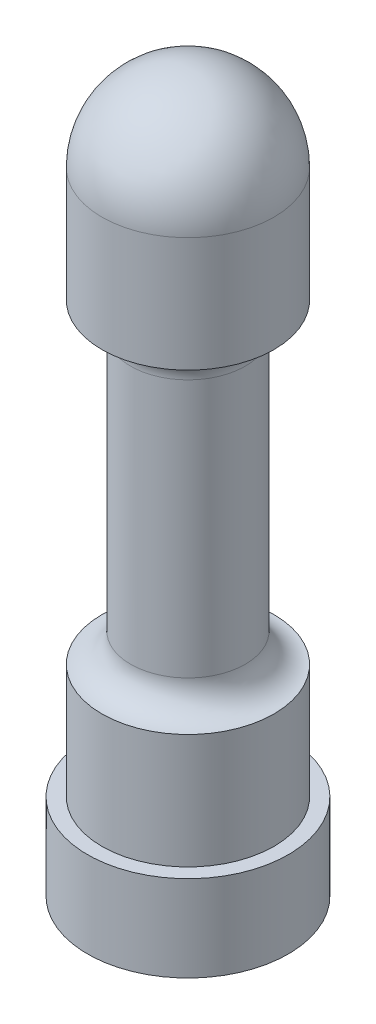
ISO-10303-21;
HEADER;
FILE_DESCRIPTION(('STEP AP214'),'2;1');
FILE_NAME('part.step','',(''),(''),'','','');
FILE_SCHEMA(('AUTOMOTIVE_DESIGN { 1 0 10303 214 1 1 1 1 }'));
ENDSEC;
DATA;
#1=APPLICATION_CONTEXT('core data for automotive mechanical design processes');
#2=APPLICATION_PROTOCOL_DEFINITION('international standard','automotive_design',2000,#1);
#3=PRODUCT_CONTEXT('',#1,'mechanical');
#4=PRODUCT('Part','Part','',(#3));
#5=PRODUCT_RELATED_PRODUCT_CATEGORY('part','',(#4));
#6=PRODUCT_DEFINITION_FORMATION('','',#4);
#7=PRODUCT_DEFINITION_CONTEXT('part definition',#1,'design');
#8=PRODUCT_DEFINITION('design','',#6,#7);
#9=PRODUCT_DEFINITION_SHAPE('','',#8);
#10=(LENGTH_UNIT() NAMED_UNIT(*) SI_UNIT(.MILLI.,.METRE.));
#11=(NAMED_UNIT(*) PLANE_ANGLE_UNIT() SI_UNIT($,.RADIAN.));
#12=(NAMED_UNIT(*) SI_UNIT($,.STERADIAN.) SOLID_ANGLE_UNIT());
#13=UNCERTAINTY_MEASURE_WITH_UNIT(LENGTH_MEASURE(1.E-05),#10,'distance_accuracy_value','');
#14=(GEOMETRIC_REPRESENTATION_CONTEXT(3) GLOBAL_UNCERTAINTY_ASSIGNED_CONTEXT((#13)) GLOBAL_UNIT_ASSIGNED_CONTEXT((#10,
#11,#12)) REPRESENTATION_CONTEXT('',''));
#15=CARTESIAN_POINT('',(0.,0.,0.));
#16=DIRECTION('',(0.,0.,1.));
#17=DIRECTION('',(1.,0.,0.));
#18=AXIS2_PLACEMENT_3D('',#15,#16,#17);
#19=CARTESIAN_POINT('',(0.,0.,0.));
#20=DIRECTION('',(0.,-1.,0.));
#21=DIRECTION('',(0.,0.,-1.));
#22=AXIS2_PLACEMENT_3D('',#19,#20,#21);
#23=CYLINDRICAL_SURFACE('',#22,3.);
#24=CARTESIAN_POINT('',(0.,22.,0.));
#25=DIRECTION('',(0.,-1.,0.));
#26=DIRECTION('',(0.,0.,-1.));
#27=AXIS2_PLACEMENT_3D('',#24,#25,#26);
#28=CIRCLE('',#27,3.);
#29=CARTESIAN_POINT('',(0.,22.,-3.));
#30=VERTEX_POINT('',#29);
#31=EDGE_CURVE('E54',#30,#30,#28,.T.);
#32=ORIENTED_EDGE('',*,*,#31,.T.);
#33=EDGE_LOOP('',(#32));
#34=FACE_BOUND('',#33,.T.);
#35=CARTESIAN_POINT('',(0.,18.,0.));
#36=DIRECTION('',(0.,-1.,0.));
#37=DIRECTION('',(0.,0.,-1.));
#38=AXIS2_PLACEMENT_3D('',#35,#36,#37);
#39=CIRCLE('',#38,3.);
#40=CARTESIAN_POINT('',(0.,18.,-3.));
#41=VERTEX_POINT('',#40);
#42=EDGE_CURVE('E59',#41,#41,#39,.T.);
#43=ORIENTED_EDGE('',*,*,#42,.F.);
#44=EDGE_LOOP('',(#43));
#45=FACE_BOUND('',#44,.T.);
#46=ADVANCED_FACE('F41',(#34,#45),#23,.T.);
#47=CARTESIAN_POINT('',(0.,0.,0.));
#48=DIRECTION('',(0.,-1.,0.));
#49=DIRECTION('',(0.,0.,-1.));
#50=AXIS2_PLACEMENT_3D('',#47,#48,#49);
#51=CYLINDRICAL_SURFACE('',#50,2.);
#52=CARTESIAN_POINT('',(0.,8.,0.));
#53=DIRECTION('',(0.,1.,0.));
#54=DIRECTION('',(0.,0.,1.));
#55=AXIS2_PLACEMENT_3D('',#52,#53,#54);
#56=CIRCLE('',#55,2.);
#57=CARTESIAN_POINT('',(0.,8.,2.));
#58=VERTEX_POINT('',#57);
#59=EDGE_CURVE('E10',#58,#58,#56,.T.);
#60=ORIENTED_EDGE('',*,*,#59,.T.);
#61=EDGE_LOOP('',(#60));
#62=FACE_BOUND('',#61,.T.);
#63=CARTESIAN_POINT('',(0.,17.,0.));
#64=DIRECTION('',(0.,-1.,0.));
#65=DIRECTION('',(0.,0.,-1.));
#66=AXIS2_PLACEMENT_3D('',#63,#64,#65);
#67=CIRCLE('',#66,2.);
#68=CARTESIAN_POINT('',(0.,17.,-2.));
#69=VERTEX_POINT('',#68);
#70=EDGE_CURVE('E49',#69,#69,#67,.T.);
#71=ORIENTED_EDGE('',*,*,#70,.T.);
#72=EDGE_LOOP('',(#71));
#73=FACE_BOUND('',#72,.T.);
#74=ADVANCED_FACE('F107',(#62,#73),#51,.T.);
#75=CARTESIAN_POINT('',(0.,0.,0.));
#76=DIRECTION('',(0.,-1.,0.));
#77=DIRECTION('',(0.,0.,-1.));
#78=AXIS2_PLACEMENT_3D('',#75,#76,#77);
#79=CYLINDRICAL_SURFACE('',#78,3.);
#80=CARTESIAN_POINT('',(0.,7.,0.));
#81=DIRECTION('',(0.,-1.,0.));
#82=DIRECTION('',(0.,0.,-1.));
#83=AXIS2_PLACEMENT_3D('',#80,#81,#82);
#84=CIRCLE('',#83,3.);
#85=CARTESIAN_POINT('',(0.,7.,-3.));
#86=VERTEX_POINT('',#85);
#87=EDGE_CURVE('E65',#86,#86,#84,.T.);
#88=ORIENTED_EDGE('',*,*,#87,.T.);
#89=EDGE_LOOP('',(#88));
#90=FACE_BOUND('',#89,.T.);
#91=CARTESIAN_POINT('',(0.,3.,0.));
#92=DIRECTION('',(0.,-1.,0.));
#93=DIRECTION('',(0.,0.,-1.));
#94=AXIS2_PLACEMENT_3D('',#91,#92,#93);
#95=CIRCLE('',#94,3.);
#96=CARTESIAN_POINT('',(0.,3.,-3.));
#97=VERTEX_POINT('',#96);
#98=EDGE_CURVE('E69',#97,#97,#95,.T.);
#99=ORIENTED_EDGE('',*,*,#98,.F.);
#100=EDGE_LOOP('',(#99));
#101=FACE_BOUND('',#100,.T.);
#102=ADVANCED_FACE('F103',(#90,#101),#79,.T.);
#103=CARTESIAN_POINT('',(3.,3.,0.));
#104=DIRECTION('',(0.,1.,0.));
#105=DIRECTION('',(0.,0.,1.));
#106=AXIS2_PLACEMENT_3D('',#103,#104,#105);
#107=PLANE('',#106);
#108=ORIENTED_EDGE('',*,*,#98,.T.);
#109=EDGE_LOOP('',(#108));
#110=FACE_BOUND('',#109,.T.);
#111=CARTESIAN_POINT('',(0.,3.,0.));
#112=DIRECTION('',(0.,-1.,0.));
#113=DIRECTION('',(0.,0.,-1.));
#114=AXIS2_PLACEMENT_3D('',#111,#112,#113);
#115=CIRCLE('',#114,3.5);
#116=CARTESIAN_POINT('',(0.,3.,-3.5));
#117=VERTEX_POINT('',#116);
#118=EDGE_CURVE('E73',#117,#117,#115,.T.);
#119=ORIENTED_EDGE('',*,*,#118,.F.);
#120=EDGE_LOOP('',(#119));
#121=FACE_BOUND('',#120,.T.);
#122=ADVANCED_FACE('F97',(#110,#121),#107,.T.);
#123=CARTESIAN_POINT('',(0.,0.,0.));
#124=DIRECTION('',(0.,-1.,0.));
#125=DIRECTION('',(0.,0.,-1.));
#126=AXIS2_PLACEMENT_3D('',#123,#124,#125);
#127=CYLINDRICAL_SURFACE('',#126,3.5);
#128=ORIENTED_EDGE('',*,*,#118,.T.);
#129=EDGE_LOOP('',(#128));
#130=FACE_BOUND('',#129,.T.);
#131=CARTESIAN_POINT('',(0.,0.,0.));
#132=DIRECTION('',(0.,-1.,0.));
#133=DIRECTION('',(0.,0.,-1.));
#134=AXIS2_PLACEMENT_3D('',#131,#132,#133);
#135=CIRCLE('',#134,3.5);
#136=CARTESIAN_POINT('',(0.,0.,-3.5));
#137=VERTEX_POINT('',#136);
#138=EDGE_CURVE('E77',#137,#137,#135,.T.);
#139=ORIENTED_EDGE('',*,*,#138,.F.);
#140=EDGE_LOOP('',(#139));
#141=FACE_BOUND('',#140,.T.);
#142=ADVANCED_FACE('F92',(#130,#141),#127,.T.);
#143=CARTESIAN_POINT('',(0.,0.,0.));
#144=DIRECTION('',(0.,-1.,0.));
#145=DIRECTION('',(0.,0.,-1.));
#146=AXIS2_PLACEMENT_3D('',#143,#144,#145);
#147=PLANE('',#146);
#148=CARTESIAN_POINT('',(0.,0.,0.));
#149=DIRECTION('',(0.,-1.,0.));
#150=DIRECTION('',(0.,0.,-1.));
#151=AXIS2_PLACEMENT_3D('',#148,#149,#150);
#152=CIRCLE('',#151,1.5);
#153=CARTESIAN_POINT('',(0.,0.,-1.5));
#154=VERTEX_POINT('',#153);
#155=EDGE_CURVE('E81',#154,#154,#152,.T.);
#156=ORIENTED_EDGE('',*,*,#155,.F.);
#157=EDGE_LOOP('',(#156));
#158=FACE_BOUND('',#157,.T.);
#159=ORIENTED_EDGE('',*,*,#138,.T.);
#160=EDGE_LOOP('',(#159));
#161=FACE_BOUND('',#160,.T.);
#162=ADVANCED_FACE('F88',(#158,#161),#147,.T.);
#163=CARTESIAN_POINT('',(0.,22.,0.));
#164=DIRECTION('',(0.,1.,0.));
#165=DIRECTION('',(0.,0.,1.));
#166=AXIS2_PLACEMENT_3D('',#163,#164,#165);
#167=SPHERICAL_SURFACE('',#166,3.);
#168=ORIENTED_EDGE('',*,*,#31,.F.);
#169=EDGE_LOOP('',(#168));
#170=FACE_BOUND('',#169,.T.);
#171=ADVANCED_FACE('F91',(#170),#167,.T.);
#172=CARTESIAN_POINT('',(0.,8.,0.));
#173=DIRECTION('',(0.,1.,0.));
#174=DIRECTION('',(0.,0.,1.));
#175=AXIS2_PLACEMENT_3D('',#172,#173,#174);
#176=TOROIDAL_SURFACE('',#175,3.,1.);
#177=ORIENTED_EDGE('',*,*,#59,.F.);
#178=EDGE_LOOP('',(#177));
#179=FACE_BOUND('',#178,.T.);
#180=ORIENTED_EDGE('',*,*,#87,.F.);
#181=EDGE_LOOP('',(#180));
#182=FACE_BOUND('',#181,.T.);
#183=ADVANCED_FACE('F118',(#179,#182),#176,.F.);
#184=CARTESIAN_POINT('',(0.,17.,0.));
#185=DIRECTION('',(0.,-1.,0.));
#186=DIRECTION('',(0.,0.,-1.));
#187=AXIS2_PLACEMENT_3D('',#184,#185,#186);
#188=TOROIDAL_SURFACE('',#187,3.,1.);
#189=ORIENTED_EDGE('',*,*,#42,.T.);
#190=EDGE_LOOP('',(#189));
#191=FACE_BOUND('',#190,.T.);
#192=ORIENTED_EDGE('',*,*,#70,.F.);
#193=EDGE_LOOP('',(#192));
#194=FACE_BOUND('',#193,.T.);
#195=ADVANCED_FACE('F43',(#191,#194),#188,.F.);
#196=CARTESIAN_POINT('',(0.,0.,0.));
#197=DIRECTION('',(0.,-1.,0.));
#198=DIRECTION('',(1.,0.,0.));
#199=AXIS2_PLACEMENT_3D('',#196,#197,#198);
#200=SPHERICAL_SURFACE('',#199,1.5);
#201=ORIENTED_EDGE('',*,*,#155,.T.);
#202=EDGE_LOOP('',(#201));
#203=FACE_BOUND('',#202,.T.);
#204=ADVANCED_FACE('F86',(#203),#200,.F.);
#205=CLOSED_SHELL('',(#46,#74,#102,#122,#142,#162,#171,#183,#195,#204));
#206=MANIFOLD_SOLID_BREP('B2',#205);
#207=ADVANCED_BREP_SHAPE_REPRESENTATION('',(#18,#206),#14);
#208=SHAPE_DEFINITION_REPRESENTATION(#9,#207);
ENDSEC;
END-ISO-10303-21;
